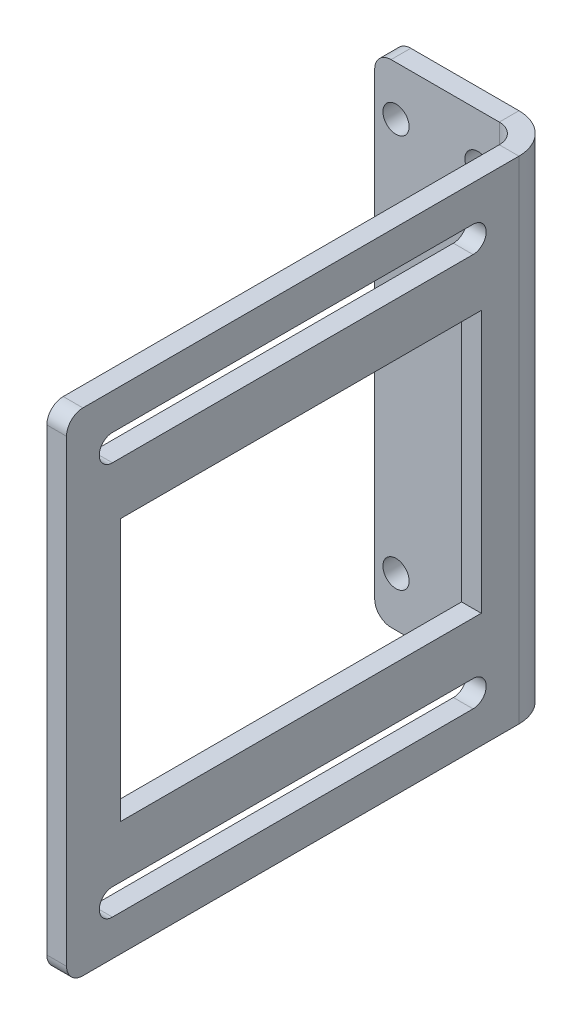
ISO-10303-21;
HEADER;
FILE_DESCRIPTION(('STEP AP214'),'2;1');
FILE_NAME('part.step','',(''),(''),'','','');
FILE_SCHEMA(('AUTOMOTIVE_DESIGN { 1 0 10303 214 1 1 1 1 }'));
ENDSEC;
DATA;
#1=APPLICATION_CONTEXT('core data for automotive mechanical design processes');
#2=APPLICATION_PROTOCOL_DEFINITION('international standard','automotive_design',2000,#1);
#3=PRODUCT_CONTEXT('',#1,'mechanical');
#4=PRODUCT('Part','Part','',(#3));
#5=PRODUCT_RELATED_PRODUCT_CATEGORY('part','',(#4));
#6=PRODUCT_DEFINITION_FORMATION('','',#4);
#7=PRODUCT_DEFINITION_CONTEXT('part definition',#1,'design');
#8=PRODUCT_DEFINITION('design','',#6,#7);
#9=PRODUCT_DEFINITION_SHAPE('','',#8);
#10=(LENGTH_UNIT() NAMED_UNIT(*) SI_UNIT(.MILLI.,.METRE.));
#11=(NAMED_UNIT(*) PLANE_ANGLE_UNIT() SI_UNIT($,.RADIAN.));
#12=(NAMED_UNIT(*) SI_UNIT($,.STERADIAN.) SOLID_ANGLE_UNIT());
#13=UNCERTAINTY_MEASURE_WITH_UNIT(LENGTH_MEASURE(1.E-05),#10,'distance_accuracy_value','');
#14=(GEOMETRIC_REPRESENTATION_CONTEXT(3) GLOBAL_UNCERTAINTY_ASSIGNED_CONTEXT((#13)) GLOBAL_UNIT_ASSIGNED_CONTEXT((#10,
#11,#12)) REPRESENTATION_CONTEXT('',''));
#15=CARTESIAN_POINT('',(0.,0.,0.));
#16=DIRECTION('',(0.,0.,1.));
#17=DIRECTION('',(1.,0.,0.));
#18=AXIS2_PLACEMENT_3D('',#15,#16,#17);
#19=CARTESIAN_POINT('',(50.,150.,-6.));
#20=DIRECTION('',(0.,1.,0.));
#21=DIRECTION('',(0.,0.,1.));
#22=AXIS2_PLACEMENT_3D('',#19,#20,#21);
#23=PLANE('',#22);
#24=DIRECTION('',(-1.,0.,0.));
#25=VECTOR('',#24,1.);
#26=CARTESIAN_POINT('',(50.,150.,-6.));
#27=LINE('',#26,#25);
#28=CARTESIAN_POINT('',(38.,150.,-6.00000000000002));
#29=VERTEX_POINT('',#28);
#30=CARTESIAN_POINT('',(5.,150.,-6.));
#31=VERTEX_POINT('',#30);
#32=EDGE_CURVE('E396',#29,#31,#27,.T.);
#33=ORIENTED_EDGE('',*,*,#32,.T.);
#34=DIRECTION('',(0.,0.,1.));
#35=VECTOR('',#34,1.);
#36=CARTESIAN_POINT('',(5.,150.,-6.));
#37=LINE('',#36,#35);
#38=CARTESIAN_POINT('',(5.,150.,0.));
#39=VERTEX_POINT('',#38);
#40=EDGE_CURVE('E460',#31,#39,#37,.T.);
#41=ORIENTED_EDGE('',*,*,#40,.T.);
#42=DIRECTION('',(-1.,0.,0.));
#43=VECTOR('',#42,1.);
#44=CARTESIAN_POINT('',(50.,150.,0.));
#45=LINE('',#44,#43);
#46=CARTESIAN_POINT('',(38.,150.,0.));
#47=VERTEX_POINT('',#46);
#48=EDGE_CURVE('E405',#47,#39,#45,.T.);
#49=ORIENTED_EDGE('',*,*,#48,.F.);
#50=DIRECTION('',(0.,0.,-1.));
#51=VECTOR('',#50,1.);
#52=CARTESIAN_POINT('',(38.,150.,0.));
#53=LINE('',#52,#51);
#54=EDGE_CURVE('E377',#47,#29,#53,.T.);
#55=ORIENTED_EDGE('',*,*,#54,.T.);
#56=EDGE_LOOP('',(#33,#41,#49,#55));
#57=FACE_BOUND('',#56,.T.);
#58=ADVANCED_FACE('F90',(#57),#23,.T.);
#59=CARTESIAN_POINT('',(0.,0.,-6.));
#60=DIRECTION('',(0.,0.,-1.));
#61=DIRECTION('',(-1.,0.,0.));
#62=AXIS2_PLACEMENT_3D('',#59,#60,#61);
#63=PLANE('',#62);
#64=CARTESIAN_POINT('',(31.5,135.,-6.));
#65=DIRECTION('',(0.,0.,-1.));
#66=DIRECTION('',(-1.,0.,0.));
#67=AXIS2_PLACEMENT_3D('',#64,#65,#66);
#68=CIRCLE('',#67,4.00000000000001);
#69=CARTESIAN_POINT('',(27.5,135.,-6.));
#70=VERTEX_POINT('',#69);
#71=EDGE_CURVE('E328',#70,#70,#68,.F.);
#72=ORIENTED_EDGE('',*,*,#71,.T.);
#73=EDGE_LOOP('',(#72));
#74=FACE_BOUND('',#73,.T.);
#75=CARTESIAN_POINT('',(6.50000000000002,15.,-6.));
#76=DIRECTION('',(0.,0.,-1.));
#77=DIRECTION('',(-1.,0.,0.));
#78=AXIS2_PLACEMENT_3D('',#75,#76,#77);
#79=CIRCLE('',#78,4.);
#80=CARTESIAN_POINT('',(2.50000000000001,15.,-6.));
#81=VERTEX_POINT('',#80);
#82=EDGE_CURVE('E329',#81,#81,#79,.F.);
#83=ORIENTED_EDGE('',*,*,#82,.T.);
#84=EDGE_LOOP('',(#83));
#85=FACE_BOUND('',#84,.T.);
#86=CARTESIAN_POINT('',(31.5,15.,-6.));
#87=DIRECTION('',(0.,0.,-1.));
#88=DIRECTION('',(-1.,0.,0.));
#89=AXIS2_PLACEMENT_3D('',#86,#87,#88);
#90=CIRCLE('',#89,4.00000000000001);
#91=CARTESIAN_POINT('',(27.5,15.,-6.));
#92=VERTEX_POINT('',#91);
#93=EDGE_CURVE('E321',#92,#92,#90,.F.);
#94=ORIENTED_EDGE('',*,*,#93,.T.);
#95=EDGE_LOOP('',(#94));
#96=FACE_BOUND('',#95,.T.);
#97=CARTESIAN_POINT('',(6.5,135.,-6.));
#98=DIRECTION('',(0.,0.,-1.));
#99=DIRECTION('',(-1.,0.,0.));
#100=AXIS2_PLACEMENT_3D('',#97,#98,#99);
#101=CIRCLE('',#100,4.00000000000001);
#102=CARTESIAN_POINT('',(2.5,135.,-6.));
#103=VERTEX_POINT('',#102);
#104=EDGE_CURVE('E339',#103,#103,#101,.F.);
#105=ORIENTED_EDGE('',*,*,#104,.T.);
#106=EDGE_LOOP('',(#105));
#107=FACE_BOUND('',#106,.T.);
#108=DIRECTION('',(1.,0.,0.));
#109=VECTOR('',#108,1.);
#110=CARTESIAN_POINT('',(50.,0.,-6.));
#111=LINE('',#110,#109);
#112=CARTESIAN_POINT('',(5.,0.,-6.));
#113=VERTEX_POINT('',#112);
#114=CARTESIAN_POINT('',(38.,0.,-6.));
#115=VERTEX_POINT('',#114);
#116=EDGE_CURVE('E394',#113,#115,#111,.T.);
#117=ORIENTED_EDGE('',*,*,#116,.F.);
#118=CARTESIAN_POINT('',(5.,5.,-6.));
#119=DIRECTION('',(0.,0.,-1.));
#120=DIRECTION('',(-1.,0.,0.));
#121=AXIS2_PLACEMENT_3D('',#118,#119,#120);
#122=CIRCLE('',#121,5.);
#123=CARTESIAN_POINT('',(0.,5.,-6.));
#124=VERTEX_POINT('',#123);
#125=EDGE_CURVE('E458',#113,#124,#122,.T.);
#126=ORIENTED_EDGE('',*,*,#125,.T.);
#127=DIRECTION('',(0.,-1.,0.));
#128=VECTOR('',#127,1.);
#129=CARTESIAN_POINT('',(0.,0.,-6.));
#130=LINE('',#129,#128);
#131=CARTESIAN_POINT('',(0.,145.,-6.));
#132=VERTEX_POINT('',#131);
#133=EDGE_CURVE('E400',#132,#124,#130,.T.);
#134=ORIENTED_EDGE('',*,*,#133,.F.);
#135=CARTESIAN_POINT('',(5.,145.,-6.));
#136=DIRECTION('',(0.,0.,-1.));
#137=DIRECTION('',(-1.,0.,0.));
#138=AXIS2_PLACEMENT_3D('',#135,#136,#137);
#139=CIRCLE('',#138,5.);
#140=EDGE_CURVE('E456',#132,#31,#139,.T.);
#141=ORIENTED_EDGE('',*,*,#140,.T.);
#142=ORIENTED_EDGE('',*,*,#32,.F.);
#143=DIRECTION('',(0.,1.,0.));
#144=VECTOR('',#143,1.);
#145=CARTESIAN_POINT('',(38.,150.,-6.00000000000002));
#146=LINE('',#145,#144);
#147=EDGE_CURVE('E370',#29,#115,#146,.F.);
#148=ORIENTED_EDGE('',*,*,#147,.T.);
#149=EDGE_LOOP('',(#117,#126,#134,#141,#142,#148));
#150=FACE_BOUND('',#149,.T.);
#151=ADVANCED_FACE('F484',(#74,#85,#96,#107,#150),#63,.T.);
#152=CARTESIAN_POINT('',(0.,0.,0.));
#153=DIRECTION('',(0.,0.,-1.));
#154=DIRECTION('',(-1.,0.,0.));
#155=AXIS2_PLACEMENT_3D('',#152,#153,#154);
#156=PLANE('',#155);
#157=CARTESIAN_POINT('',(31.5,135.,0.));
#158=DIRECTION('',(0.,0.,1.));
#159=DIRECTION('',(1.,0.,0.));
#160=AXIS2_PLACEMENT_3D('',#157,#158,#159);
#161=CIRCLE('',#160,4.00000000000001);
#162=CARTESIAN_POINT('',(35.5,135.,0.));
#163=VERTEX_POINT('',#162);
#164=EDGE_CURVE('E325',#163,#163,#161,.T.);
#165=ORIENTED_EDGE('',*,*,#164,.F.);
#166=EDGE_LOOP('',(#165));
#167=FACE_BOUND('',#166,.T.);
#168=CARTESIAN_POINT('',(6.50000000000002,15.,0.));
#169=DIRECTION('',(0.,0.,1.));
#170=DIRECTION('',(1.,0.,0.));
#171=AXIS2_PLACEMENT_3D('',#168,#169,#170);
#172=CIRCLE('',#171,4.);
#173=CARTESIAN_POINT('',(10.5,15.,0.));
#174=VERTEX_POINT('',#173);
#175=EDGE_CURVE('E324',#174,#174,#172,.T.);
#176=ORIENTED_EDGE('',*,*,#175,.F.);
#177=EDGE_LOOP('',(#176));
#178=FACE_BOUND('',#177,.T.);
#179=CARTESIAN_POINT('',(31.5,15.,0.));
#180=DIRECTION('',(0.,0.,1.));
#181=DIRECTION('',(1.,0.,0.));
#182=AXIS2_PLACEMENT_3D('',#179,#180,#181);
#183=CIRCLE('',#182,4.00000000000001);
#184=CARTESIAN_POINT('',(35.5,15.,0.));
#185=VERTEX_POINT('',#184);
#186=EDGE_CURVE('E294',#185,#185,#183,.T.);
#187=ORIENTED_EDGE('',*,*,#186,.F.);
#188=EDGE_LOOP('',(#187));
#189=FACE_BOUND('',#188,.T.);
#190=CARTESIAN_POINT('',(6.5,135.,0.));
#191=DIRECTION('',(0.,0.,1.));
#192=DIRECTION('',(1.,0.,0.));
#193=AXIS2_PLACEMENT_3D('',#190,#191,#192);
#194=CIRCLE('',#193,4.00000000000001);
#195=CARTESIAN_POINT('',(10.5,135.,0.));
#196=VERTEX_POINT('',#195);
#197=EDGE_CURVE('E332',#196,#196,#194,.T.);
#198=ORIENTED_EDGE('',*,*,#197,.F.);
#199=EDGE_LOOP('',(#198));
#200=FACE_BOUND('',#199,.T.);
#201=DIRECTION('',(0.,-1.,0.));
#202=VECTOR('',#201,1.);
#203=CARTESIAN_POINT('',(0.,0.,0.));
#204=LINE('',#203,#202);
#205=CARTESIAN_POINT('',(0.,145.,0.));
#206=VERTEX_POINT('',#205);
#207=CARTESIAN_POINT('',(0.,5.,0.));
#208=VERTEX_POINT('',#207);
#209=EDGE_CURVE('E397',#206,#208,#204,.T.);
#210=ORIENTED_EDGE('',*,*,#209,.T.);
#211=CARTESIAN_POINT('',(5.,5.,0.));
#212=DIRECTION('',(0.,0.,-1.));
#213=DIRECTION('',(-1.,0.,0.));
#214=AXIS2_PLACEMENT_3D('',#211,#212,#213);
#215=CIRCLE('',#214,5.);
#216=CARTESIAN_POINT('',(5.,0.,0.));
#217=VERTEX_POINT('',#216);
#218=EDGE_CURVE('E452',#208,#217,#215,.F.);
#219=ORIENTED_EDGE('',*,*,#218,.T.);
#220=DIRECTION('',(1.,0.,0.));
#221=VECTOR('',#220,1.);
#222=CARTESIAN_POINT('',(50.,0.,0.));
#223=LINE('',#222,#221);
#224=CARTESIAN_POINT('',(38.,0.,0.));
#225=VERTEX_POINT('',#224);
#226=EDGE_CURVE('E391',#217,#225,#223,.T.);
#227=ORIENTED_EDGE('',*,*,#226,.T.);
#228=DIRECTION('',(0.,1.,0.));
#229=VECTOR('',#228,1.);
#230=CARTESIAN_POINT('',(38.,150.,0.));
#231=LINE('',#230,#229);
#232=EDGE_CURVE('E383',#47,#225,#231,.F.);
#233=ORIENTED_EDGE('',*,*,#232,.F.);
#234=ORIENTED_EDGE('',*,*,#48,.T.);
#235=CARTESIAN_POINT('',(5.,145.,0.));
#236=DIRECTION('',(0.,0.,-1.));
#237=DIRECTION('',(-1.,0.,0.));
#238=AXIS2_PLACEMENT_3D('',#235,#236,#237);
#239=CIRCLE('',#238,5.);
#240=EDGE_CURVE('E450',#39,#206,#239,.F.);
#241=ORIENTED_EDGE('',*,*,#240,.T.);
#242=EDGE_LOOP('',(#210,#219,#227,#233,#234,#241));
#243=FACE_BOUND('',#242,.T.);
#244=ADVANCED_FACE('F490',(#167,#178,#189,#200,#243),#156,.F.);
#245=CARTESIAN_POINT('',(50.,0.,-6.));
#246=DIRECTION('',(0.,-1.,0.));
#247=DIRECTION('',(1.,0.,0.));
#248=AXIS2_PLACEMENT_3D('',#245,#246,#247);
#249=PLANE('',#248);
#250=ORIENTED_EDGE('',*,*,#226,.F.);
#251=DIRECTION('',(0.,0.,1.));
#252=VECTOR('',#251,1.);
#253=CARTESIAN_POINT('',(5.,0.,-6.));
#254=LINE('',#253,#252);
#255=EDGE_CURVE('E454',#217,#113,#254,.F.);
#256=ORIENTED_EDGE('',*,*,#255,.T.);
#257=ORIENTED_EDGE('',*,*,#116,.T.);
#258=DIRECTION('',(0.,0.,-1.));
#259=VECTOR('',#258,1.);
#260=CARTESIAN_POINT('',(38.,0.,0.));
#261=LINE('',#260,#259);
#262=EDGE_CURVE('E388',#225,#115,#261,.T.);
#263=ORIENTED_EDGE('',*,*,#262,.F.);
#264=EDGE_LOOP('',(#250,#256,#257,#263));
#265=FACE_BOUND('',#264,.T.);
#266=ADVANCED_FACE('F497',(#265),#249,.T.);
#267=CARTESIAN_POINT('',(0.,0.,-6.));
#268=DIRECTION('',(-1.,0.,0.));
#269=DIRECTION('',(0.,0.,1.));
#270=AXIS2_PLACEMENT_3D('',#267,#268,#269);
#271=PLANE('',#270);
#272=ORIENTED_EDGE('',*,*,#133,.T.);
#273=DIRECTION('',(0.,0.,1.));
#274=VECTOR('',#273,1.);
#275=CARTESIAN_POINT('',(0.,5.,-6.));
#276=LINE('',#275,#274);
#277=EDGE_CURVE('E447',#124,#208,#276,.T.);
#278=ORIENTED_EDGE('',*,*,#277,.T.);
#279=ORIENTED_EDGE('',*,*,#209,.F.);
#280=DIRECTION('',(0.,0.,1.));
#281=VECTOR('',#280,1.);
#282=CARTESIAN_POINT('',(0.,145.,-6.));
#283=LINE('',#282,#281);
#284=EDGE_CURVE('E445',#206,#132,#283,.F.);
#285=ORIENTED_EDGE('',*,*,#284,.T.);
#286=EDGE_LOOP('',(#272,#278,#279,#285));
#287=FACE_BOUND('',#286,.T.);
#288=ADVANCED_FACE('F495',(#287),#271,.T.);
#289=CARTESIAN_POINT('',(38.,0.,5.99999999999999));
#290=DIRECTION('',(0.,-1.,0.));
#291=DIRECTION('',(0.,0.,-1.));
#292=AXIS2_PLACEMENT_3D('',#289,#290,#291);
#293=PLANE('',#292);
#294=DIRECTION('',(-1.,0.,0.));
#295=VECTOR('',#294,1.);
#296=CARTESIAN_POINT('',(50.,0.,5.99999999999996));
#297=LINE('',#296,#295);
#298=CARTESIAN_POINT('',(44.,0.,5.99999999999997));
#299=VERTEX_POINT('',#298);
#300=CARTESIAN_POINT('',(50.,0.,5.99999999999995));
#301=VERTEX_POINT('',#300);
#302=EDGE_CURVE('E342',#299,#301,#297,.F.);
#303=ORIENTED_EDGE('',*,*,#302,.F.);
#304=CARTESIAN_POINT('',(38.,0.,5.99999999999999));
#305=DIRECTION('',(0.,1.,0.));
#306=DIRECTION('',(0.,0.,1.));
#307=AXIS2_PLACEMENT_3D('',#304,#305,#306);
#308=CIRCLE('',#307,6.00000000000001);
#309=EDGE_CURVE('E380',#225,#299,#308,.F.);
#310=ORIENTED_EDGE('',*,*,#309,.F.);
#311=ORIENTED_EDGE('',*,*,#262,.T.);
#312=CARTESIAN_POINT('',(38.,0.,5.99999999999999));
#313=DIRECTION('',(0.,1.,0.));
#314=DIRECTION('',(0.,0.,1.));
#315=AXIS2_PLACEMENT_3D('',#312,#313,#314);
#316=CIRCLE('',#315,12.);
#317=EDGE_CURVE('E373',#115,#301,#316,.F.);
#318=ORIENTED_EDGE('',*,*,#317,.T.);
#319=EDGE_LOOP('',(#303,#310,#311,#318));
#320=FACE_BOUND('',#319,.T.);
#321=ADVANCED_FACE('F541',(#320),#293,.T.);
#322=CARTESIAN_POINT('',(38.,150.,5.99999999999999));
#323=DIRECTION('',(0.,-1.,0.));
#324=DIRECTION('',(0.,0.,-1.));
#325=AXIS2_PLACEMENT_3D('',#322,#323,#324);
#326=PLANE('',#325);
#327=CARTESIAN_POINT('',(38.,150.,5.99999999999999));
#328=DIRECTION('',(0.,1.,0.));
#329=DIRECTION('',(0.,0.,1.));
#330=AXIS2_PLACEMENT_3D('',#327,#328,#329);
#331=CIRCLE('',#330,6.00000000000001);
#332=CARTESIAN_POINT('',(44.,150.,5.99999999999997));
#333=VERTEX_POINT('',#332);
#334=EDGE_CURVE('E345',#333,#47,#331,.T.);
#335=ORIENTED_EDGE('',*,*,#334,.F.);
#336=DIRECTION('',(-1.,0.,0.));
#337=VECTOR('',#336,1.);
#338=CARTESIAN_POINT('',(44.,150.,5.99999999999997));
#339=LINE('',#338,#337);
#340=CARTESIAN_POINT('',(50.,150.,5.99999999999995));
#341=VERTEX_POINT('',#340);
#342=EDGE_CURVE('E363',#333,#341,#339,.F.);
#343=ORIENTED_EDGE('',*,*,#342,.T.);
#344=CARTESIAN_POINT('',(38.,150.,5.99999999999999));
#345=DIRECTION('',(0.,1.,0.));
#346=DIRECTION('',(0.,0.,1.));
#347=AXIS2_PLACEMENT_3D('',#344,#345,#346);
#348=CIRCLE('',#347,12.);
#349=EDGE_CURVE('E374',#341,#29,#348,.T.);
#350=ORIENTED_EDGE('',*,*,#349,.T.);
#351=ORIENTED_EDGE('',*,*,#54,.F.);
#352=EDGE_LOOP('',(#335,#343,#350,#351));
#353=FACE_BOUND('',#352,.T.);
#354=ADVANCED_FACE('F528',(#353),#326,.F.);
#355=CARTESIAN_POINT('',(38.,150.,5.99999999999999));
#356=DIRECTION('',(0.,1.,0.));
#357=DIRECTION('',(1.,0.,0.));
#358=AXIS2_PLACEMENT_3D('',#355,#356,#357);
#359=CYLINDRICAL_SURFACE('',#358,12.);
#360=ORIENTED_EDGE('',*,*,#147,.F.);
#361=ORIENTED_EDGE('',*,*,#349,.F.);
#362=DIRECTION('',(0.,1.,0.));
#363=VECTOR('',#362,1.);
#364=CARTESIAN_POINT('',(50.,0.,5.99999999999996));
#365=LINE('',#364,#363);
#366=EDGE_CURVE('E360',#341,#301,#365,.F.);
#367=ORIENTED_EDGE('',*,*,#366,.T.);
#368=ORIENTED_EDGE('',*,*,#317,.F.);
#369=EDGE_LOOP('',(#360,#361,#367,#368));
#370=FACE_BOUND('',#369,.T.);
#371=ADVANCED_FACE('F543',(#370),#359,.T.);
#372=CARTESIAN_POINT('',(38.,150.,5.99999999999999));
#373=DIRECTION('',(0.,1.,0.));
#374=DIRECTION('',(1.,0.,0.));
#375=AXIS2_PLACEMENT_3D('',#372,#373,#374);
#376=CYLINDRICAL_SURFACE('',#375,6.00000000000001);
#377=ORIENTED_EDGE('',*,*,#232,.T.);
#378=ORIENTED_EDGE('',*,*,#309,.T.);
#379=DIRECTION('',(0.,1.,0.));
#380=VECTOR('',#379,1.);
#381=CARTESIAN_POINT('',(44.,0.,5.99999999999998));
#382=LINE('',#381,#380);
#383=EDGE_CURVE('E366',#299,#333,#382,.T.);
#384=ORIENTED_EDGE('',*,*,#383,.T.);
#385=ORIENTED_EDGE('',*,*,#334,.T.);
#386=EDGE_LOOP('',(#377,#378,#384,#385));
#387=FACE_BOUND('',#386,.T.);
#388=ADVANCED_FACE('F532',(#387),#376,.F.);
#389=CARTESIAN_POINT('',(50.0000000000005,150.,144.));
#390=DIRECTION('',(0.,-1.,0.));
#391=DIRECTION('',(1.,0.,0.));
#392=AXIS2_PLACEMENT_3D('',#389,#390,#391);
#393=PLANE('',#392);
#394=DIRECTION('',(0.,0.,-1.));
#395=VECTOR('',#394,1.);
#396=CARTESIAN_POINT('',(44.0000000000005,150.,144.));
#397=LINE('',#396,#395);
#398=CARTESIAN_POINT('',(44.0000000000005,150.,139.));
#399=VERTEX_POINT('',#398);
#400=EDGE_CURVE('E357',#333,#399,#397,.F.);
#401=ORIENTED_EDGE('',*,*,#400,.T.);
#402=DIRECTION('',(-1.,0.,0.));
#403=VECTOR('',#402,1.);
#404=CARTESIAN_POINT('',(50.0000000000005,150.,139.));
#405=LINE('',#404,#403);
#406=CARTESIAN_POINT('',(50.0000000000005,150.,139.));
#407=VERTEX_POINT('',#406);
#408=EDGE_CURVE('E436',#399,#407,#405,.F.);
#409=ORIENTED_EDGE('',*,*,#408,.T.);
#410=DIRECTION('',(0.,0.,1.));
#411=VECTOR('',#410,1.);
#412=CARTESIAN_POINT('',(50.,150.,-1.94421235630739E-13));
#413=LINE('',#412,#411);
#414=EDGE_CURVE('E349',#341,#407,#413,.T.);
#415=ORIENTED_EDGE('',*,*,#414,.F.);
#416=ORIENTED_EDGE('',*,*,#342,.F.);
#417=EDGE_LOOP('',(#401,#409,#415,#416));
#418=FACE_BOUND('',#417,.T.);
#419=ADVANCED_FACE('F550',(#418),#393,.F.);
#420=CARTESIAN_POINT('',(50.,0.,0.));
#421=DIRECTION('',(0.,1.,0.));
#422=DIRECTION('',(-1.,0.,0.));
#423=AXIS2_PLACEMENT_3D('',#420,#421,#422);
#424=PLANE('',#423);
#425=DIRECTION('',(0.,0.,-1.));
#426=VECTOR('',#425,1.);
#427=CARTESIAN_POINT('',(50.,0.,-1.9442123563074E-13));
#428=LINE('',#427,#426);
#429=CARTESIAN_POINT('',(50.0000000000005,0.,139.));
#430=VERTEX_POINT('',#429);
#431=EDGE_CURVE('E343',#430,#301,#428,.T.);
#432=ORIENTED_EDGE('',*,*,#431,.F.);
#433=DIRECTION('',(-1.,0.,0.));
#434=VECTOR('',#433,1.);
#435=CARTESIAN_POINT('',(50.0000000000005,0.,139.));
#436=LINE('',#435,#434);
#437=CARTESIAN_POINT('',(44.0000000000005,0.,139.));
#438=VERTEX_POINT('',#437);
#439=EDGE_CURVE('E442',#430,#438,#436,.T.);
#440=ORIENTED_EDGE('',*,*,#439,.T.);
#441=DIRECTION('',(0.,0.,1.));
#442=VECTOR('',#441,1.);
#443=CARTESIAN_POINT('',(44.,0.,0.));
#444=LINE('',#443,#442);
#445=EDGE_CURVE('E352',#438,#299,#444,.F.);
#446=ORIENTED_EDGE('',*,*,#445,.T.);
#447=ORIENTED_EDGE('',*,*,#302,.T.);
#448=EDGE_LOOP('',(#432,#440,#446,#447));
#449=FACE_BOUND('',#448,.T.);
#450=ADVANCED_FACE('F562',(#449),#424,.F.);
#451=CARTESIAN_POINT('',(50.,0.,-1.9442123563074E-13));
#452=DIRECTION('',(-1.,0.,0.));
#453=DIRECTION('',(0.,0.,1.));
#454=AXIS2_PLACEMENT_3D('',#451,#452,#453);
#455=PLANE('',#454);
#456=DIRECTION('',(0.,0.,-1.));
#457=VECTOR('',#456,1.);
#458=CARTESIAN_POINT('',(50.,115.,-1.72730196207323E-13));
#459=LINE('',#458,#457);
#460=CARTESIAN_POINT('',(50.0000000000004,115.,127.5));
#461=VERTEX_POINT('',#460);
#462=CARTESIAN_POINT('',(50.,115.,17.5));
#463=VERTEX_POINT('',#462);
#464=EDGE_CURVE('E261',#461,#463,#459,.T.);
#465=ORIENTED_EDGE('',*,*,#464,.T.);
#466=DIRECTION('',(0.,1.,0.));
#467=VECTOR('',#466,1.);
#468=CARTESIAN_POINT('',(50.0000000000001,0.,17.5));
#469=LINE('',#468,#467);
#470=CARTESIAN_POINT('',(50.0000000000001,35.,17.5));
#471=VERTEX_POINT('',#470);
#472=EDGE_CURVE('E105',#471,#463,#469,.T.);
#473=ORIENTED_EDGE('',*,*,#472,.F.);
#474=DIRECTION('',(0.,0.,-1.));
#475=VECTOR('',#474,1.);
#476=CARTESIAN_POINT('',(50.,35.,-1.72730196207323E-13));
#477=LINE('',#476,#475);
#478=CARTESIAN_POINT('',(50.0000000000004,35.,127.5));
#479=VERTEX_POINT('',#478);
#480=EDGE_CURVE('E269',#479,#471,#477,.T.);
#481=ORIENTED_EDGE('',*,*,#480,.F.);
#482=DIRECTION('',(0.,1.,0.));
#483=VECTOR('',#482,1.);
#484=CARTESIAN_POINT('',(50.0000000000004,0.,127.5));
#485=LINE('',#484,#483);
#486=EDGE_CURVE('E253',#479,#461,#485,.T.);
#487=ORIENTED_EDGE('',*,*,#486,.T.);
#488=EDGE_LOOP('',(#465,#473,#481,#487));
#489=FACE_BOUND('',#488,.T.);
#490=DIRECTION('',(0.,0.,-1.));
#491=VECTOR('',#490,1.);
#492=CARTESIAN_POINT('',(50.0000000000004,131.,130.));
#493=LINE('',#492,#491);
#494=CARTESIAN_POINT('',(50.0000000000004,131.,130.));
#495=VERTEX_POINT('',#494);
#496=CARTESIAN_POINT('',(50.,131.,20.));
#497=VERTEX_POINT('',#496);
#498=EDGE_CURVE('E281',#495,#497,#493,.T.);
#499=ORIENTED_EDGE('',*,*,#498,.F.);
#500=CARTESIAN_POINT('',(50.0000000000004,135.,130.));
#501=DIRECTION('',(1.,0.,0.));
#502=DIRECTION('',(0.,0.,-1.));
#503=AXIS2_PLACEMENT_3D('',#500,#501,#502);
#504=CIRCLE('',#503,4.00000000000005);
#505=CARTESIAN_POINT('',(50.0000000000004,139.,130.));
#506=VERTEX_POINT('',#505);
#507=EDGE_CURVE('E279',#506,#495,#504,.T.);
#508=ORIENTED_EDGE('',*,*,#507,.F.);
#509=DIRECTION('',(0.,0.,1.));
#510=VECTOR('',#509,1.);
#511=CARTESIAN_POINT('',(50.0000000000004,139.,130.));
#512=LINE('',#511,#510);
#513=CARTESIAN_POINT('',(50.,139.,20.));
#514=VERTEX_POINT('',#513);
#515=EDGE_CURVE('E288',#514,#506,#512,.T.);
#516=ORIENTED_EDGE('',*,*,#515,.F.);
#517=CARTESIAN_POINT('',(50.,135.,20.));
#518=DIRECTION('',(1.,0.,0.));
#519=DIRECTION('',(0.,0.,-1.));
#520=AXIS2_PLACEMENT_3D('',#517,#518,#519);
#521=CIRCLE('',#520,4.00000000000005);
#522=EDGE_CURVE('E285',#497,#514,#521,.T.);
#523=ORIENTED_EDGE('',*,*,#522,.F.);
#524=EDGE_LOOP('',(#499,#508,#516,#523));
#525=FACE_BOUND('',#524,.T.);
#526=DIRECTION('',(0.,0.,-1.));
#527=VECTOR('',#526,1.);
#528=CARTESIAN_POINT('',(50.0000000000005,10.9999999999999,130.));
#529=LINE('',#528,#527);
#530=CARTESIAN_POINT('',(50.0000000000005,10.9999999999999,130.));
#531=VERTEX_POINT('',#530);
#532=CARTESIAN_POINT('',(50.0000000000001,11.,20.));
#533=VERTEX_POINT('',#532);
#534=EDGE_CURVE('E302',#531,#533,#529,.T.);
#535=ORIENTED_EDGE('',*,*,#534,.F.);
#536=CARTESIAN_POINT('',(50.0000000000005,15.,130.));
#537=DIRECTION('',(1.,0.,0.));
#538=DIRECTION('',(0.,0.,1.));
#539=AXIS2_PLACEMENT_3D('',#536,#537,#538);
#540=CIRCLE('',#539,4.00000000000005);
#541=CARTESIAN_POINT('',(50.0000000000004,19.,130.));
#542=VERTEX_POINT('',#541);
#543=EDGE_CURVE('E275',#542,#531,#540,.T.);
#544=ORIENTED_EDGE('',*,*,#543,.F.);
#545=DIRECTION('',(0.,0.,1.));
#546=VECTOR('',#545,1.);
#547=CARTESIAN_POINT('',(50.0000000000004,19.,130.));
#548=LINE('',#547,#546);
#549=CARTESIAN_POINT('',(50.0000000000001,19.,20.));
#550=VERTEX_POINT('',#549);
#551=EDGE_CURVE('E308',#550,#542,#548,.T.);
#552=ORIENTED_EDGE('',*,*,#551,.F.);
#553=CARTESIAN_POINT('',(50.0000000000001,15.,20.));
#554=DIRECTION('',(1.,0.,0.));
#555=DIRECTION('',(0.,0.,1.));
#556=AXIS2_PLACEMENT_3D('',#553,#554,#555);
#557=CIRCLE('',#556,4.00000000000005);
#558=EDGE_CURVE('E305',#533,#550,#557,.T.);
#559=ORIENTED_EDGE('',*,*,#558,.F.);
#560=EDGE_LOOP('',(#535,#544,#552,#559));
#561=FACE_BOUND('',#560,.T.);
#562=ORIENTED_EDGE('',*,*,#414,.T.);
#563=CARTESIAN_POINT('',(50.0000000000005,145.,139.));
#564=DIRECTION('',(-1.,0.,0.));
#565=DIRECTION('',(0.,0.,1.));
#566=AXIS2_PLACEMENT_3D('',#563,#564,#565);
#567=CIRCLE('',#566,5.);
#568=CARTESIAN_POINT('',(50.0000000000005,145.,144.));
#569=VERTEX_POINT('',#568);
#570=EDGE_CURVE('E440',#407,#569,#567,.F.);
#571=ORIENTED_EDGE('',*,*,#570,.T.);
#572=DIRECTION('',(0.,-1.,0.));
#573=VECTOR('',#572,1.);
#574=CARTESIAN_POINT('',(50.0000000000005,0.,144.));
#575=LINE('',#574,#573);
#576=CARTESIAN_POINT('',(50.0000000000005,5.,144.));
#577=VERTEX_POINT('',#576);
#578=EDGE_CURVE('E346',#569,#577,#575,.T.);
#579=ORIENTED_EDGE('',*,*,#578,.T.);
#580=CARTESIAN_POINT('',(50.0000000000005,5.,139.));
#581=DIRECTION('',(-1.,0.,0.));
#582=DIRECTION('',(0.,0.,1.));
#583=AXIS2_PLACEMENT_3D('',#580,#581,#582);
#584=CIRCLE('',#583,5.);
#585=EDGE_CURVE('E438',#577,#430,#584,.F.);
#586=ORIENTED_EDGE('',*,*,#585,.T.);
#587=ORIENTED_EDGE('',*,*,#431,.T.);
#588=ORIENTED_EDGE('',*,*,#366,.F.);
#589=EDGE_LOOP('',(#562,#571,#579,#586,#587,#588));
#590=FACE_BOUND('',#589,.T.);
#591=ADVANCED_FACE('F266',(#489,#525,#561,#590),#455,.F.);
#592=CARTESIAN_POINT('',(44.,0.,-1.73472347597681E-13));
#593=DIRECTION('',(-1.,0.,0.));
#594=DIRECTION('',(0.,0.,1.));
#595=AXIS2_PLACEMENT_3D('',#592,#593,#594);
#596=PLANE('',#595);
#597=DIRECTION('',(0.,-1.,0.));
#598=VECTOR('',#597,1.);
#599=CARTESIAN_POINT('',(44.0000000000001,0.,17.5));
#600=LINE('',#599,#598);
#601=CARTESIAN_POINT('',(44.0000000000002,115.,17.5));
#602=VERTEX_POINT('',#601);
#603=CARTESIAN_POINT('',(44.0000000000002,35.,17.5));
#604=VERTEX_POINT('',#603);
#605=EDGE_CURVE('E13',#602,#604,#600,.T.);
#606=ORIENTED_EDGE('',*,*,#605,.F.);
#607=DIRECTION('',(0.,0.,1.));
#608=VECTOR('',#607,1.);
#609=CARTESIAN_POINT('',(44.,115.,-1.73472347597681E-13));
#610=LINE('',#609,#608);
#611=CARTESIAN_POINT('',(44.0000000000004,115.,127.5));
#612=VERTEX_POINT('',#611);
#613=EDGE_CURVE('E463',#602,#612,#610,.T.);
#614=ORIENTED_EDGE('',*,*,#613,.T.);
#615=DIRECTION('',(0.,-1.,0.));
#616=VECTOR('',#615,1.);
#617=CARTESIAN_POINT('',(44.0000000000004,0.,127.5));
#618=LINE('',#617,#616);
#619=CARTESIAN_POINT('',(44.0000000000004,35.,127.5));
#620=VERTEX_POINT('',#619);
#621=EDGE_CURVE('E256',#612,#620,#618,.T.);
#622=ORIENTED_EDGE('',*,*,#621,.T.);
#623=DIRECTION('',(0.,0.,1.));
#624=VECTOR('',#623,1.);
#625=CARTESIAN_POINT('',(44.,35.,-1.73472347597681E-13));
#626=LINE('',#625,#624);
#627=EDGE_CURVE('E98',#604,#620,#626,.T.);
#628=ORIENTED_EDGE('',*,*,#627,.F.);
#629=EDGE_LOOP('',(#606,#614,#622,#628));
#630=FACE_BOUND('',#629,.T.);
#631=CARTESIAN_POINT('',(44.0000000000004,135.,130.));
#632=DIRECTION('',(-1.,0.,0.));
#633=DIRECTION('',(0.,0.,1.));
#634=AXIS2_PLACEMENT_3D('',#631,#632,#633);
#635=CIRCLE('',#634,4.00000000000005);
#636=CARTESIAN_POINT('',(44.0000000000002,131.,130.));
#637=VERTEX_POINT('',#636);
#638=CARTESIAN_POINT('',(44.0000000000002,139.,130.));
#639=VERTEX_POINT('',#638);
#640=EDGE_CURVE('E425',#637,#639,#635,.T.);
#641=ORIENTED_EDGE('',*,*,#640,.F.);
#642=DIRECTION('',(0.,0.,1.));
#643=VECTOR('',#642,1.);
#644=CARTESIAN_POINT('',(44.,131.,-1.73472347597681E-13));
#645=LINE('',#644,#643);
#646=CARTESIAN_POINT('',(44.,131.,20.));
#647=VERTEX_POINT('',#646);
#648=EDGE_CURVE('E418',#647,#637,#645,.T.);
#649=ORIENTED_EDGE('',*,*,#648,.F.);
#650=CARTESIAN_POINT('',(44.,135.,20.));
#651=DIRECTION('',(-1.,0.,0.));
#652=DIRECTION('',(0.,0.,1.));
#653=AXIS2_PLACEMENT_3D('',#650,#651,#652);
#654=CIRCLE('',#653,4.00000000000005);
#655=CARTESIAN_POINT('',(44.0000000000001,139.,20.));
#656=VERTEX_POINT('',#655);
#657=EDGE_CURVE('E420',#656,#647,#654,.T.);
#658=ORIENTED_EDGE('',*,*,#657,.F.);
#659=DIRECTION('',(0.,0.,-1.));
#660=VECTOR('',#659,1.);
#661=CARTESIAN_POINT('',(44.,139.,-1.73472347597681E-13));
#662=LINE('',#661,#660);
#663=EDGE_CURVE('E423',#639,#656,#662,.T.);
#664=ORIENTED_EDGE('',*,*,#663,.F.);
#665=EDGE_LOOP('',(#641,#649,#658,#664));
#666=FACE_BOUND('',#665,.T.);
#667=CARTESIAN_POINT('',(44.0000000000005,15.,130.));
#668=DIRECTION('',(-1.,0.,0.));
#669=DIRECTION('',(0.,0.,1.));
#670=AXIS2_PLACEMENT_3D('',#667,#668,#669);
#671=CIRCLE('',#670,4.00000000000005);
#672=CARTESIAN_POINT('',(44.0000000000003,10.9999999999999,130.));
#673=VERTEX_POINT('',#672);
#674=CARTESIAN_POINT('',(44.0000000000003,19.,130.));
#675=VERTEX_POINT('',#674);
#676=EDGE_CURVE('E416',#673,#675,#671,.T.);
#677=ORIENTED_EDGE('',*,*,#676,.F.);
#678=DIRECTION('',(0.,0.,1.));
#679=VECTOR('',#678,1.);
#680=CARTESIAN_POINT('',(44.,11.,-1.72084568816899E-13));
#681=LINE('',#680,#679);
#682=CARTESIAN_POINT('',(44.0000000000001,11.,20.));
#683=VERTEX_POINT('',#682);
#684=EDGE_CURVE('E403',#683,#673,#681,.T.);
#685=ORIENTED_EDGE('',*,*,#684,.F.);
#686=CARTESIAN_POINT('',(44.0000000000001,15.,20.));
#687=DIRECTION('',(-1.,0.,0.));
#688=DIRECTION('',(0.,0.,1.));
#689=AXIS2_PLACEMENT_3D('',#686,#687,#688);
#690=CIRCLE('',#689,4.00000000000005);
#691=CARTESIAN_POINT('',(44.0000000000001,19.,20.));
#692=VERTEX_POINT('',#691);
#693=EDGE_CURVE('E411',#692,#683,#690,.T.);
#694=ORIENTED_EDGE('',*,*,#693,.F.);
#695=DIRECTION('',(0.,0.,-1.));
#696=VECTOR('',#695,1.);
#697=CARTESIAN_POINT('',(44.,19.0000000000001,-1.71075275158149E-13));
#698=LINE('',#697,#696);
#699=EDGE_CURVE('E414',#675,#692,#698,.T.);
#700=ORIENTED_EDGE('',*,*,#699,.F.);
#701=EDGE_LOOP('',(#677,#685,#694,#700));
#702=FACE_BOUND('',#701,.T.);
#703=DIRECTION('',(0.,1.,0.));
#704=VECTOR('',#703,1.);
#705=CARTESIAN_POINT('',(44.0000000000005,0.,144.));
#706=LINE('',#705,#704);
#707=CARTESIAN_POINT('',(44.0000000000005,145.,144.));
#708=VERTEX_POINT('',#707);
#709=CARTESIAN_POINT('',(44.0000000000005,5.,144.));
#710=VERTEX_POINT('',#709);
#711=EDGE_CURVE('E354',#708,#710,#706,.F.);
#712=ORIENTED_EDGE('',*,*,#711,.F.);
#713=CARTESIAN_POINT('',(44.0000000000005,145.,139.));
#714=DIRECTION('',(-1.,0.,0.));
#715=DIRECTION('',(0.,0.,1.));
#716=AXIS2_PLACEMENT_3D('',#713,#714,#715);
#717=CIRCLE('',#716,5.);
#718=EDGE_CURVE('E434',#708,#399,#717,.T.);
#719=ORIENTED_EDGE('',*,*,#718,.T.);
#720=ORIENTED_EDGE('',*,*,#400,.F.);
#721=ORIENTED_EDGE('',*,*,#383,.F.);
#722=ORIENTED_EDGE('',*,*,#445,.F.);
#723=CARTESIAN_POINT('',(44.0000000000005,5.,139.));
#724=DIRECTION('',(-1.,0.,0.));
#725=DIRECTION('',(0.,0.,1.));
#726=AXIS2_PLACEMENT_3D('',#723,#724,#725);
#727=CIRCLE('',#726,5.);
#728=EDGE_CURVE('E432',#438,#710,#727,.T.);
#729=ORIENTED_EDGE('',*,*,#728,.T.);
#730=EDGE_LOOP('',(#712,#719,#720,#721,#722,#729));
#731=FACE_BOUND('',#730,.T.);
#732=ADVANCED_FACE('F471',(#630,#666,#702,#731),#596,.T.);
#733=CARTESIAN_POINT('',(50.0000000000005,0.,144.));
#734=DIRECTION('',(0.,0.,-1.));
#735=DIRECTION('',(-1.,0.,0.));
#736=AXIS2_PLACEMENT_3D('',#733,#734,#735);
#737=PLANE('',#736);
#738=ORIENTED_EDGE('',*,*,#578,.F.);
#739=DIRECTION('',(-1.,0.,0.));
#740=VECTOR('',#739,1.);
#741=CARTESIAN_POINT('',(50.0000000000005,145.,144.));
#742=LINE('',#741,#740);
#743=EDGE_CURVE('E429',#569,#708,#742,.T.);
#744=ORIENTED_EDGE('',*,*,#743,.T.);
#745=ORIENTED_EDGE('',*,*,#711,.T.);
#746=DIRECTION('',(-1.,0.,0.));
#747=VECTOR('',#746,1.);
#748=CARTESIAN_POINT('',(50.0000000000005,5.,144.));
#749=LINE('',#748,#747);
#750=EDGE_CURVE('E427',#710,#577,#749,.F.);
#751=ORIENTED_EDGE('',*,*,#750,.T.);
#752=EDGE_LOOP('',(#738,#744,#745,#751));
#753=FACE_BOUND('',#752,.T.);
#754=ADVANCED_FACE('F557',(#753),#737,.F.);
#755=CARTESIAN_POINT('',(6.5,135.,-17.3137084989848));
#756=DIRECTION('',(0.,0.,1.));
#757=DIRECTION('',(1.,0.,0.));
#758=AXIS2_PLACEMENT_3D('',#755,#756,#757);
#759=CYLINDRICAL_SURFACE('',#758,4.00000000000001);
#760=ORIENTED_EDGE('',*,*,#197,.T.);
#761=EDGE_LOOP('',(#760));
#762=FACE_BOUND('',#761,.T.);
#763=ORIENTED_EDGE('',*,*,#104,.F.);
#764=EDGE_LOOP('',(#763));
#765=FACE_BOUND('',#764,.T.);
#766=ADVANCED_FACE('F571',(#762,#765),#759,.F.);
#767=CARTESIAN_POINT('',(31.5,15.,-17.3137084989848));
#768=DIRECTION('',(0.,0.,1.));
#769=DIRECTION('',(1.,0.,0.));
#770=AXIS2_PLACEMENT_3D('',#767,#768,#769);
#771=CYLINDRICAL_SURFACE('',#770,4.00000000000001);
#772=ORIENTED_EDGE('',*,*,#186,.T.);
#773=EDGE_LOOP('',(#772));
#774=FACE_BOUND('',#773,.T.);
#775=ORIENTED_EDGE('',*,*,#93,.F.);
#776=EDGE_LOOP('',(#775));
#777=FACE_BOUND('',#776,.T.);
#778=ADVANCED_FACE('F601',(#774,#777),#771,.F.);
#779=CARTESIAN_POINT('',(6.50000000000002,15.,-17.3137084989848));
#780=DIRECTION('',(0.,0.,1.));
#781=DIRECTION('',(1.,0.,0.));
#782=AXIS2_PLACEMENT_3D('',#779,#780,#781);
#783=CYLINDRICAL_SURFACE('',#782,4.);
#784=ORIENTED_EDGE('',*,*,#175,.T.);
#785=EDGE_LOOP('',(#784));
#786=FACE_BOUND('',#785,.T.);
#787=ORIENTED_EDGE('',*,*,#82,.F.);
#788=EDGE_LOOP('',(#787));
#789=FACE_BOUND('',#788,.T.);
#790=ADVANCED_FACE('F607',(#786,#789),#783,.F.);
#791=CARTESIAN_POINT('',(31.5,135.,-17.3137084989848));
#792=DIRECTION('',(0.,0.,1.));
#793=DIRECTION('',(1.,0.,0.));
#794=AXIS2_PLACEMENT_3D('',#791,#792,#793);
#795=CYLINDRICAL_SURFACE('',#794,4.00000000000001);
#796=ORIENTED_EDGE('',*,*,#164,.T.);
#797=EDGE_LOOP('',(#796));
#798=FACE_BOUND('',#797,.T.);
#799=ORIENTED_EDGE('',*,*,#71,.F.);
#800=EDGE_LOOP('',(#799));
#801=FACE_BOUND('',#800,.T.);
#802=ADVANCED_FACE('F613',(#798,#801),#795,.F.);
#803=CARTESIAN_POINT('',(40.0000000000005,15.,130.));
#804=DIRECTION('',(1.,0.,0.));
#805=DIRECTION('',(0.,0.,-1.));
#806=AXIS2_PLACEMENT_3D('',#803,#804,#805);
#807=CYLINDRICAL_SURFACE('',#806,4.00000000000005);
#808=ORIENTED_EDGE('',*,*,#676,.T.);
#809=DIRECTION('',(1.,0.,0.));
#810=VECTOR('',#809,1.);
#811=CARTESIAN_POINT('',(40.0000000000004,19.,130.));
#812=LINE('',#811,#810);
#813=EDGE_CURVE('E282',#675,#542,#812,.T.);
#814=ORIENTED_EDGE('',*,*,#813,.T.);
#815=ORIENTED_EDGE('',*,*,#543,.T.);
#816=DIRECTION('',(1.,0.,0.));
#817=VECTOR('',#816,1.);
#818=CARTESIAN_POINT('',(40.0000000000005,10.9999999999999,130.));
#819=LINE('',#818,#817);
#820=EDGE_CURVE('E311',#673,#531,#819,.T.);
#821=ORIENTED_EDGE('',*,*,#820,.F.);
#822=EDGE_LOOP('',(#808,#814,#815,#821));
#823=FACE_BOUND('',#822,.T.);
#824=ADVANCED_FACE('F616',(#823),#807,.F.);
#825=CARTESIAN_POINT('',(40.0000000000004,19.,130.));
#826=DIRECTION('',(0.,1.,0.));
#827=DIRECTION('',(-1.,0.,0.));
#828=AXIS2_PLACEMENT_3D('',#825,#826,#827);
#829=PLANE('',#828);
#830=ORIENTED_EDGE('',*,*,#699,.T.);
#831=DIRECTION('',(1.,0.,0.));
#832=VECTOR('',#831,1.);
#833=CARTESIAN_POINT('',(40.0000000000001,19.,20.));
#834=LINE('',#833,#832);
#835=EDGE_CURVE('E313',#692,#550,#834,.T.);
#836=ORIENTED_EDGE('',*,*,#835,.T.);
#837=ORIENTED_EDGE('',*,*,#551,.T.);
#838=ORIENTED_EDGE('',*,*,#813,.F.);
#839=EDGE_LOOP('',(#830,#836,#837,#838));
#840=FACE_BOUND('',#839,.T.);
#841=ADVANCED_FACE('F621',(#840),#829,.F.);
#842=CARTESIAN_POINT('',(40.0000000000001,15.,20.));
#843=DIRECTION('',(1.,0.,0.));
#844=DIRECTION('',(0.,0.,-1.));
#845=AXIS2_PLACEMENT_3D('',#842,#843,#844);
#846=CYLINDRICAL_SURFACE('',#845,4.00000000000005);
#847=ORIENTED_EDGE('',*,*,#693,.T.);
#848=DIRECTION('',(1.,0.,0.));
#849=VECTOR('',#848,1.);
#850=CARTESIAN_POINT('',(40.0000000000001,11.,20.));
#851=LINE('',#850,#849);
#852=EDGE_CURVE('E315',#683,#533,#851,.T.);
#853=ORIENTED_EDGE('',*,*,#852,.T.);
#854=ORIENTED_EDGE('',*,*,#558,.T.);
#855=ORIENTED_EDGE('',*,*,#835,.F.);
#856=EDGE_LOOP('',(#847,#853,#854,#855));
#857=FACE_BOUND('',#856,.T.);
#858=ADVANCED_FACE('F627',(#857),#846,.F.);
#859=CARTESIAN_POINT('',(40.0000000000005,10.9999999999999,130.));
#860=DIRECTION('',(0.,-1.,0.));
#861=DIRECTION('',(1.,0.,0.));
#862=AXIS2_PLACEMENT_3D('',#859,#860,#861);
#863=PLANE('',#862);
#864=ORIENTED_EDGE('',*,*,#684,.T.);
#865=ORIENTED_EDGE('',*,*,#820,.T.);
#866=ORIENTED_EDGE('',*,*,#534,.T.);
#867=ORIENTED_EDGE('',*,*,#852,.F.);
#868=EDGE_LOOP('',(#864,#865,#866,#867));
#869=FACE_BOUND('',#868,.T.);
#870=ADVANCED_FACE('F623',(#869),#863,.F.);
#871=CARTESIAN_POINT('',(40.0000000000004,135.,130.));
#872=DIRECTION('',(1.,0.,0.));
#873=DIRECTION('',(0.,0.,-1.));
#874=AXIS2_PLACEMENT_3D('',#871,#872,#873);
#875=CYLINDRICAL_SURFACE('',#874,4.00000000000005);
#876=ORIENTED_EDGE('',*,*,#640,.T.);
#877=DIRECTION('',(1.,0.,0.));
#878=VECTOR('',#877,1.);
#879=CARTESIAN_POINT('',(40.0000000000004,139.,130.));
#880=LINE('',#879,#878);
#881=EDGE_CURVE('E292',#639,#506,#880,.T.);
#882=ORIENTED_EDGE('',*,*,#881,.T.);
#883=ORIENTED_EDGE('',*,*,#507,.T.);
#884=DIRECTION('',(1.,0.,0.));
#885=VECTOR('',#884,1.);
#886=CARTESIAN_POINT('',(40.0000000000004,131.,130.));
#887=LINE('',#886,#885);
#888=EDGE_CURVE('E291',#637,#495,#887,.T.);
#889=ORIENTED_EDGE('',*,*,#888,.F.);
#890=EDGE_LOOP('',(#876,#882,#883,#889));
#891=FACE_BOUND('',#890,.T.);
#892=ADVANCED_FACE('F626',(#891),#875,.F.);
#893=CARTESIAN_POINT('',(40.0000000000004,139.,130.));
#894=DIRECTION('',(0.,1.,0.));
#895=DIRECTION('',(-1.,0.,0.));
#896=AXIS2_PLACEMENT_3D('',#893,#894,#895);
#897=PLANE('',#896);
#898=ORIENTED_EDGE('',*,*,#663,.T.);
#899=DIRECTION('',(1.,0.,0.));
#900=VECTOR('',#899,1.);
#901=CARTESIAN_POINT('',(40.,139.,20.));
#902=LINE('',#901,#900);
#903=EDGE_CURVE('E295',#656,#514,#902,.T.);
#904=ORIENTED_EDGE('',*,*,#903,.T.);
#905=ORIENTED_EDGE('',*,*,#515,.T.);
#906=ORIENTED_EDGE('',*,*,#881,.F.);
#907=EDGE_LOOP('',(#898,#904,#905,#906));
#908=FACE_BOUND('',#907,.T.);
#909=ADVANCED_FACE('F637',(#908),#897,.F.);
#910=CARTESIAN_POINT('',(40.,135.,20.));
#911=DIRECTION('',(1.,0.,0.));
#912=DIRECTION('',(0.,0.,-1.));
#913=AXIS2_PLACEMENT_3D('',#910,#911,#912);
#914=CYLINDRICAL_SURFACE('',#913,4.00000000000005);
#915=ORIENTED_EDGE('',*,*,#657,.T.);
#916=DIRECTION('',(1.,0.,0.));
#917=VECTOR('',#916,1.);
#918=CARTESIAN_POINT('',(40.,131.,20.));
#919=LINE('',#918,#917);
#920=EDGE_CURVE('E297',#647,#497,#919,.T.);
#921=ORIENTED_EDGE('',*,*,#920,.T.);
#922=ORIENTED_EDGE('',*,*,#522,.T.);
#923=ORIENTED_EDGE('',*,*,#903,.F.);
#924=EDGE_LOOP('',(#915,#921,#922,#923));
#925=FACE_BOUND('',#924,.T.);
#926=ADVANCED_FACE('F641',(#925),#914,.F.);
#927=CARTESIAN_POINT('',(40.0000000000004,131.,130.));
#928=DIRECTION('',(0.,-1.,0.));
#929=DIRECTION('',(1.,0.,0.));
#930=AXIS2_PLACEMENT_3D('',#927,#928,#929);
#931=PLANE('',#930);
#932=ORIENTED_EDGE('',*,*,#648,.T.);
#933=ORIENTED_EDGE('',*,*,#888,.T.);
#934=ORIENTED_EDGE('',*,*,#498,.T.);
#935=ORIENTED_EDGE('',*,*,#920,.F.);
#936=EDGE_LOOP('',(#932,#933,#934,#935));
#937=FACE_BOUND('',#936,.T.);
#938=ADVANCED_FACE('F505',(#937),#931,.F.);
#939=CARTESIAN_POINT('',(50.0000000000005,145.,139.));
#940=DIRECTION('',(-1.,0.,0.));
#941=DIRECTION('',(0.,0.,1.));
#942=AXIS2_PLACEMENT_3D('',#939,#940,#941);
#943=CYLINDRICAL_SURFACE('',#942,5.);
#944=ORIENTED_EDGE('',*,*,#570,.F.);
#945=ORIENTED_EDGE('',*,*,#408,.F.);
#946=ORIENTED_EDGE('',*,*,#718,.F.);
#947=ORIENTED_EDGE('',*,*,#743,.F.);
#948=EDGE_LOOP('',(#944,#945,#946,#947));
#949=FACE_BOUND('',#948,.T.);
#950=ADVANCED_FACE('F501',(#949),#943,.T.);
#951=CARTESIAN_POINT('',(50.0000000000005,5.,139.));
#952=DIRECTION('',(-1.,0.,0.));
#953=DIRECTION('',(0.,0.,1.));
#954=AXIS2_PLACEMENT_3D('',#951,#952,#953);
#955=CYLINDRICAL_SURFACE('',#954,5.);
#956=ORIENTED_EDGE('',*,*,#585,.F.);
#957=ORIENTED_EDGE('',*,*,#750,.F.);
#958=ORIENTED_EDGE('',*,*,#728,.F.);
#959=ORIENTED_EDGE('',*,*,#439,.F.);
#960=EDGE_LOOP('',(#956,#957,#958,#959));
#961=FACE_BOUND('',#960,.T.);
#962=ADVANCED_FACE('F504',(#961),#955,.T.);
#963=CARTESIAN_POINT('',(5.,5.,-6.));
#964=DIRECTION('',(0.,0.,1.));
#965=DIRECTION('',(1.,0.,0.));
#966=AXIS2_PLACEMENT_3D('',#963,#964,#965);
#967=CYLINDRICAL_SURFACE('',#966,5.);
#968=ORIENTED_EDGE('',*,*,#125,.F.);
#969=ORIENTED_EDGE('',*,*,#255,.F.);
#970=ORIENTED_EDGE('',*,*,#218,.F.);
#971=ORIENTED_EDGE('',*,*,#277,.F.);
#972=EDGE_LOOP('',(#968,#969,#970,#971));
#973=FACE_BOUND('',#972,.T.);
#974=ADVANCED_FACE('F481',(#973),#967,.T.);
#975=CARTESIAN_POINT('',(5.,145.,-6.));
#976=DIRECTION('',(0.,0.,1.));
#977=DIRECTION('',(1.,0.,0.));
#978=AXIS2_PLACEMENT_3D('',#975,#976,#977);
#979=CYLINDRICAL_SURFACE('',#978,5.);
#980=ORIENTED_EDGE('',*,*,#140,.F.);
#981=ORIENTED_EDGE('',*,*,#284,.F.);
#982=ORIENTED_EDGE('',*,*,#240,.F.);
#983=ORIENTED_EDGE('',*,*,#40,.F.);
#984=EDGE_LOOP('',(#980,#981,#982,#983));
#985=FACE_BOUND('',#984,.T.);
#986=ADVANCED_FACE('F92',(#985),#979,.T.);
#987=CARTESIAN_POINT('',(40.0000000000001,0.,17.5));
#988=DIRECTION('',(0.,0.,-1.));
#989=DIRECTION('',(-1.,0.,0.));
#990=AXIS2_PLACEMENT_3D('',#987,#988,#989);
#991=PLANE('',#990);
#992=ORIENTED_EDGE('',*,*,#605,.T.);
#993=DIRECTION('',(1.,0.,0.));
#994=VECTOR('',#993,1.);
#995=CARTESIAN_POINT('',(40.0000000000001,35.,17.5));
#996=LINE('',#995,#994);
#997=EDGE_CURVE('E276',#604,#471,#996,.T.);
#998=ORIENTED_EDGE('',*,*,#997,.T.);
#999=ORIENTED_EDGE('',*,*,#472,.T.);
#1000=DIRECTION('',(1.,0.,0.));
#1001=VECTOR('',#1000,1.);
#1002=CARTESIAN_POINT('',(40.,115.,17.5));
#1003=LINE('',#1002,#1001);
#1004=EDGE_CURVE('E263',#602,#463,#1003,.T.);
#1005=ORIENTED_EDGE('',*,*,#1004,.F.);
#1006=EDGE_LOOP('',(#992,#998,#999,#1005));
#1007=FACE_BOUND('',#1006,.T.);
#1008=ADVANCED_FACE('F473',(#1007),#991,.F.);
#1009=CARTESIAN_POINT('',(40.,35.,-1.38035726687787E-13));
#1010=DIRECTION('',(0.,-1.,0.));
#1011=DIRECTION('',(1.,0.,0.));
#1012=AXIS2_PLACEMENT_3D('',#1009,#1010,#1011);
#1013=PLANE('',#1012);
#1014=ORIENTED_EDGE('',*,*,#627,.T.);
#1015=DIRECTION('',(1.,0.,0.));
#1016=VECTOR('',#1015,1.);
#1017=CARTESIAN_POINT('',(40.0000000000004,35.,127.5));
#1018=LINE('',#1017,#1016);
#1019=EDGE_CURVE('E258',#620,#479,#1018,.T.);
#1020=ORIENTED_EDGE('',*,*,#1019,.T.);
#1021=ORIENTED_EDGE('',*,*,#480,.T.);
#1022=ORIENTED_EDGE('',*,*,#997,.F.);
#1023=EDGE_LOOP('',(#1014,#1020,#1021,#1022));
#1024=FACE_BOUND('',#1023,.T.);
#1025=ADVANCED_FACE('F468',(#1024),#1013,.F.);
#1026=CARTESIAN_POINT('',(40.0000000000004,0.,127.5));
#1027=DIRECTION('',(0.,0.,-1.));
#1028=DIRECTION('',(-1.,0.,0.));
#1029=AXIS2_PLACEMENT_3D('',#1026,#1027,#1028);
#1030=PLANE('',#1029);
#1031=DIRECTION('',(1.,0.,0.));
#1032=VECTOR('',#1031,1.);
#1033=CARTESIAN_POINT('',(40.0000000000004,115.,127.5));
#1034=LINE('',#1033,#1032);
#1035=EDGE_CURVE('E113',#612,#461,#1034,.T.);
#1036=ORIENTED_EDGE('',*,*,#1035,.T.);
#1037=ORIENTED_EDGE('',*,*,#486,.F.);
#1038=ORIENTED_EDGE('',*,*,#1019,.F.);
#1039=ORIENTED_EDGE('',*,*,#621,.F.);
#1040=EDGE_LOOP('',(#1036,#1037,#1038,#1039));
#1041=FACE_BOUND('',#1040,.T.);
#1042=ADVANCED_FACE('F250',(#1041),#1030,.T.);
#1043=CARTESIAN_POINT('',(40.,115.,-1.38035726687787E-13));
#1044=DIRECTION('',(0.,-1.,0.));
#1045=DIRECTION('',(1.,0.,0.));
#1046=AXIS2_PLACEMENT_3D('',#1043,#1044,#1045);
#1047=PLANE('',#1046);
#1048=ORIENTED_EDGE('',*,*,#1004,.T.);
#1049=ORIENTED_EDGE('',*,*,#464,.F.);
#1050=ORIENTED_EDGE('',*,*,#1035,.F.);
#1051=ORIENTED_EDGE('',*,*,#613,.F.);
#1052=EDGE_LOOP('',(#1048,#1049,#1050,#1051));
#1053=FACE_BOUND('',#1052,.T.);
#1054=ADVANCED_FACE('F262',(#1053),#1047,.T.);
#1055=CLOSED_SHELL('',(#58,#151,#244,#266,#288,#321,#354,#371,#388,#419,#450,#591,#732,#754,
#766,#778,#790,#802,#824,#841,#858,#870,#892,#909,#926,#938,#950,#962,#974,#986,#1008,#1025,
#1042,#1054));
#1056=MANIFOLD_SOLID_BREP('B2',#1055);
#1057=ADVANCED_BREP_SHAPE_REPRESENTATION('',(#18,#1056),#14);
#1058=SHAPE_DEFINITION_REPRESENTATION(#9,#1057);
ENDSEC;
END-ISO-10303-21;
